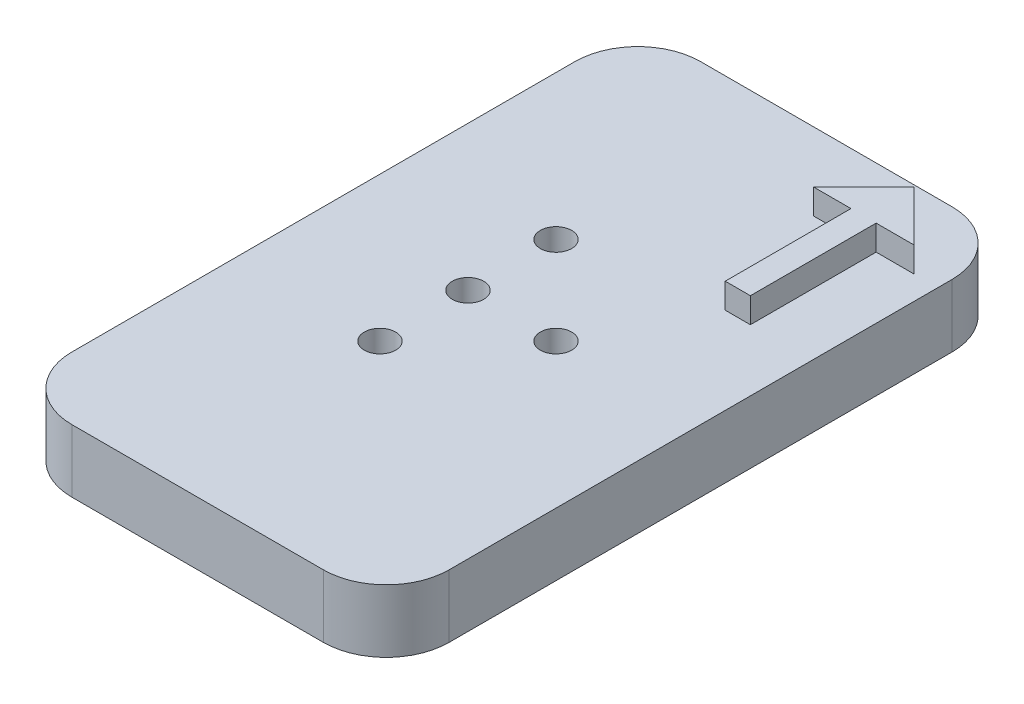
ISO-10303-21;
HEADER;
FILE_DESCRIPTION(('STEP AP214'),'2;1');
FILE_NAME('part.step','',(''),(''),'','','');
FILE_SCHEMA(('AUTOMOTIVE_DESIGN { 1 0 10303 214 1 1 1 1 }'));
ENDSEC;
DATA;
#1=APPLICATION_CONTEXT('core data for automotive mechanical design processes');
#2=APPLICATION_PROTOCOL_DEFINITION('international standard','automotive_design',2000,#1);
#3=PRODUCT_CONTEXT('',#1,'mechanical');
#4=PRODUCT('Part','Part','',(#3));
#5=PRODUCT_RELATED_PRODUCT_CATEGORY('part','',(#4));
#6=PRODUCT_DEFINITION_FORMATION('','',#4);
#7=PRODUCT_DEFINITION_CONTEXT('part definition',#1,'design');
#8=PRODUCT_DEFINITION('design','',#6,#7);
#9=PRODUCT_DEFINITION_SHAPE('','',#8);
#10=(LENGTH_UNIT() NAMED_UNIT(*) SI_UNIT(.MILLI.,.METRE.));
#11=(NAMED_UNIT(*) PLANE_ANGLE_UNIT() SI_UNIT($,.RADIAN.));
#12=(NAMED_UNIT(*) SI_UNIT($,.STERADIAN.) SOLID_ANGLE_UNIT());
#13=UNCERTAINTY_MEASURE_WITH_UNIT(LENGTH_MEASURE(1.E-05),#10,'distance_accuracy_value','');
#14=(GEOMETRIC_REPRESENTATION_CONTEXT(3) GLOBAL_UNCERTAINTY_ASSIGNED_CONTEXT((#13)) GLOBAL_UNIT_ASSIGNED_CONTEXT((#10,
#11,#12)) REPRESENTATION_CONTEXT('',''));
#15=CARTESIAN_POINT('',(0.,0.,0.));
#16=DIRECTION('',(0.,0.,1.));
#17=DIRECTION('',(1.,0.,0.));
#18=AXIS2_PLACEMENT_3D('',#15,#16,#17);
#19=CARTESIAN_POINT('',(0.,5.,0.));
#20=DIRECTION('',(0.,1.,0.));
#21=DIRECTION('',(0.,0.,1.));
#22=AXIS2_PLACEMENT_3D('',#19,#20,#21);
#23=PLANE('',#22);
#24=CARTESIAN_POINT('',(7.,5.,0.));
#25=DIRECTION('',(0.,1.,0.));
#26=DIRECTION('',(0.,0.,1.));
#27=AXIS2_PLACEMENT_3D('',#24,#25,#26);
#28=CIRCLE('',#27,1.25);
#29=CARTESIAN_POINT('',(7.,5.,1.25));
#30=VERTEX_POINT('',#29);
#31=EDGE_CURVE('E178',#30,#30,#28,.T.);
#32=ORIENTED_EDGE('',*,*,#31,.F.);
#33=EDGE_LOOP('',(#32));
#34=FACE_BOUND('',#33,.T.);
#35=CARTESIAN_POINT('',(0.,5.,0.));
#36=DIRECTION('',(0.,1.,0.));
#37=DIRECTION('',(0.,0.,1.));
#38=AXIS2_PLACEMENT_3D('',#35,#36,#37);
#39=CIRCLE('',#38,1.25);
#40=CARTESIAN_POINT('',(0.,5.,1.25));
#41=VERTEX_POINT('',#40);
#42=EDGE_CURVE('E190',#41,#41,#39,.T.);
#43=ORIENTED_EDGE('',*,*,#42,.F.);
#44=EDGE_LOOP('',(#43));
#45=FACE_BOUND('',#44,.T.);
#46=DIRECTION('',(0.,0.,1.));
#47=VECTOR('',#46,1.);
#48=CARTESIAN_POINT('',(-11.5,5.,-25.));
#49=LINE('',#48,#47);
#50=CARTESIAN_POINT('',(-11.5,5.,-20.));
#51=VERTEX_POINT('',#50);
#52=CARTESIAN_POINT('',(-11.5,5.,20.));
#53=VERTEX_POINT('',#52);
#54=EDGE_CURVE('E196',#51,#53,#49,.T.);
#55=ORIENTED_EDGE('',*,*,#54,.T.);
#56=CARTESIAN_POINT('',(-6.5,5.,20.));
#57=DIRECTION('',(0.,1.,0.));
#58=DIRECTION('',(0.,0.,1.));
#59=AXIS2_PLACEMENT_3D('',#56,#57,#58);
#60=CIRCLE('',#59,5.);
#61=CARTESIAN_POINT('',(-6.5,5.,25.));
#62=VERTEX_POINT('',#61);
#63=EDGE_CURVE('E241',#53,#62,#60,.T.);
#64=ORIENTED_EDGE('',*,*,#63,.T.);
#65=DIRECTION('',(1.,0.,0.));
#66=VECTOR('',#65,1.);
#67=CARTESIAN_POINT('',(-11.5,5.,25.));
#68=LINE('',#67,#66);
#69=CARTESIAN_POINT('',(13.5,5.,25.));
#70=VERTEX_POINT('',#69);
#71=EDGE_CURVE('E199',#62,#70,#68,.T.);
#72=ORIENTED_EDGE('',*,*,#71,.T.);
#73=CARTESIAN_POINT('',(13.5,5.,20.));
#74=DIRECTION('',(0.,1.,0.));
#75=DIRECTION('',(0.,0.,1.));
#76=AXIS2_PLACEMENT_3D('',#73,#74,#75);
#77=CIRCLE('',#76,5.);
#78=CARTESIAN_POINT('',(18.5,5.,20.));
#79=VERTEX_POINT('',#78);
#80=EDGE_CURVE('E239',#70,#79,#77,.T.);
#81=ORIENTED_EDGE('',*,*,#80,.T.);
#82=DIRECTION('',(0.,0.,-1.));
#83=VECTOR('',#82,1.);
#84=CARTESIAN_POINT('',(18.5,5.,-25.));
#85=LINE('',#84,#83);
#86=CARTESIAN_POINT('',(18.5,5.,-20.));
#87=VERTEX_POINT('',#86);
#88=EDGE_CURVE('E203',#79,#87,#85,.T.);
#89=ORIENTED_EDGE('',*,*,#88,.T.);
#90=CARTESIAN_POINT('',(13.5,5.,-20.));
#91=DIRECTION('',(0.,1.,0.));
#92=DIRECTION('',(0.,0.,1.));
#93=AXIS2_PLACEMENT_3D('',#90,#91,#92);
#94=CIRCLE('',#93,5.);
#95=CARTESIAN_POINT('',(13.5,5.,-25.));
#96=VERTEX_POINT('',#95);
#97=EDGE_CURVE('E237',#87,#96,#94,.T.);
#98=ORIENTED_EDGE('',*,*,#97,.T.);
#99=DIRECTION('',(-1.,0.,0.));
#100=VECTOR('',#99,1.);
#101=CARTESIAN_POINT('',(-11.5,5.,-25.));
#102=LINE('',#101,#100);
#103=CARTESIAN_POINT('',(-6.50000000000001,5.,-25.));
#104=VERTEX_POINT('',#103);
#105=EDGE_CURVE('E206',#96,#104,#102,.T.);
#106=ORIENTED_EDGE('',*,*,#105,.T.);
#107=CARTESIAN_POINT('',(-6.50000000000001,5.,-20.));
#108=DIRECTION('',(0.,1.,0.));
#109=DIRECTION('',(0.,0.,1.));
#110=AXIS2_PLACEMENT_3D('',#107,#108,#109);
#111=CIRCLE('',#110,5.);
#112=EDGE_CURVE('E235',#104,#51,#111,.T.);
#113=ORIENTED_EDGE('',*,*,#112,.T.);
#114=EDGE_LOOP('',(#55,#64,#72,#81,#89,#98,#106,#113));
#115=FACE_BOUND('',#114,.T.);
#116=CARTESIAN_POINT('',(0.,5.,-7.));
#117=DIRECTION('',(0.,1.,0.));
#118=DIRECTION('',(0.,0.,1.));
#119=AXIS2_PLACEMENT_3D('',#116,#117,#118);
#120=CIRCLE('',#119,1.25);
#121=CARTESIAN_POINT('',(0.,5.,-5.75));
#122=VERTEX_POINT('',#121);
#123=EDGE_CURVE('E184',#122,#122,#120,.T.);
#124=ORIENTED_EDGE('',*,*,#123,.F.);
#125=EDGE_LOOP('',(#124));
#126=FACE_BOUND('',#125,.T.);
#127=CARTESIAN_POINT('',(0.,5.,7.));
#128=DIRECTION('',(0.,1.,0.));
#129=DIRECTION('',(0.,0.,1.));
#130=AXIS2_PLACEMENT_3D('',#127,#128,#129);
#131=CIRCLE('',#130,1.25);
#132=CARTESIAN_POINT('',(0.,5.,8.25));
#133=VERTEX_POINT('',#132);
#134=EDGE_CURVE('E169',#133,#133,#131,.T.);
#135=ORIENTED_EDGE('',*,*,#134,.F.);
#136=EDGE_LOOP('',(#135));
#137=FACE_BOUND('',#136,.T.);
#138=DIRECTION('',(0.,0.,1.));
#139=VECTOR('',#138,1.);
#140=CARTESIAN_POINT('',(11.6008130371531,5.,-18.8562206984604));
#141=LINE('',#140,#139);
#142=CARTESIAN_POINT('',(11.6008130371531,5.,-18.8562206984604));
#143=VERTEX_POINT('',#142);
#144=CARTESIAN_POINT('',(11.6008130371531,5.,-8.85622069846038));
#145=VERTEX_POINT('',#144);
#146=EDGE_CURVE('E466',#143,#145,#141,.T.);
#147=ORIENTED_EDGE('',*,*,#146,.F.);
#148=DIRECTION('',(1.,0.,0.));
#149=VECTOR('',#148,1.);
#150=CARTESIAN_POINT('',(8.6008130371531,5.,-18.8562206984604));
#151=LINE('',#150,#149);
#152=CARTESIAN_POINT('',(8.6008130371531,5.,-18.8562206984604));
#153=VERTEX_POINT('',#152);
#154=EDGE_CURVE('E164',#153,#143,#151,.T.);
#155=ORIENTED_EDGE('',*,*,#154,.F.);
#156=DIRECTION('',(-0.707106781186547,0.,0.707106781186547));
#157=VECTOR('',#156,1.);
#158=CARTESIAN_POINT('',(12.6008130371531,5.,-22.8562206984604));
#159=LINE('',#158,#157);
#160=CARTESIAN_POINT('',(12.6008130371531,5.,-22.8562206984604));
#161=VERTEX_POINT('',#160);
#162=EDGE_CURVE('E160',#161,#153,#159,.T.);
#163=ORIENTED_EDGE('',*,*,#162,.F.);
#164=DIRECTION('',(-0.707106781186547,0.,-0.707106781186547));
#165=VECTOR('',#164,1.);
#166=CARTESIAN_POINT('',(16.6008130371531,5.,-18.8562206984604));
#167=LINE('',#166,#165);
#168=CARTESIAN_POINT('',(16.6008130371531,5.,-18.8562206984604));
#169=VERTEX_POINT('',#168);
#170=EDGE_CURVE('E462',#169,#161,#167,.T.);
#171=ORIENTED_EDGE('',*,*,#170,.F.);
#172=DIRECTION('',(1.,0.,0.));
#173=VECTOR('',#172,1.);
#174=CARTESIAN_POINT('',(13.6008130371531,5.,-18.8562206984604));
#175=LINE('',#174,#173);
#176=CARTESIAN_POINT('',(13.6008130371531,5.,-18.8562206984604));
#177=VERTEX_POINT('',#176);
#178=EDGE_CURVE('E476',#177,#169,#175,.T.);
#179=ORIENTED_EDGE('',*,*,#178,.F.);
#180=DIRECTION('',(0.,0.,-1.));
#181=VECTOR('',#180,1.);
#182=CARTESIAN_POINT('',(13.6008130371531,5.,-8.85622069846038));
#183=LINE('',#182,#181);
#184=CARTESIAN_POINT('',(13.6008130371531,5.,-8.85622069846038));
#185=VERTEX_POINT('',#184);
#186=EDGE_CURVE('E474',#185,#177,#183,.T.);
#187=ORIENTED_EDGE('',*,*,#186,.F.);
#188=DIRECTION('',(1.,0.,0.));
#189=VECTOR('',#188,1.);
#190=CARTESIAN_POINT('',(11.6008130371531,5.,-8.85622069846038));
#191=LINE('',#190,#189);
#192=EDGE_CURVE('E468',#145,#185,#191,.T.);
#193=ORIENTED_EDGE('',*,*,#192,.F.);
#194=EDGE_LOOP('',(#147,#155,#163,#171,#179,#187,#193));
#195=FACE_BOUND('',#194,.T.);
#196=ADVANCED_FACE('F33',(#34,#45,#115,#126,#137,#195),#23,.T.);
#197=CARTESIAN_POINT('',(0.,0.,0.));
#198=DIRECTION('',(0.,1.,0.));
#199=DIRECTION('',(0.,0.,1.));
#200=AXIS2_PLACEMENT_3D('',#197,#198,#199);
#201=PLANE('',#200);
#202=DIRECTION('',(1.,0.,0.));
#203=VECTOR('',#202,1.);
#204=CARTESIAN_POINT('',(-11.5,0.,25.));
#205=LINE('',#204,#203);
#206=CARTESIAN_POINT('',(-6.5,0.,25.));
#207=VERTEX_POINT('',#206);
#208=CARTESIAN_POINT('',(13.5,0.,25.));
#209=VERTEX_POINT('',#208);
#210=EDGE_CURVE('E211',#207,#209,#205,.T.);
#211=ORIENTED_EDGE('',*,*,#210,.F.);
#212=CARTESIAN_POINT('',(-6.5,0.,20.));
#213=DIRECTION('',(0.,1.,0.));
#214=DIRECTION('',(0.,0.,1.));
#215=AXIS2_PLACEMENT_3D('',#212,#213,#214);
#216=CIRCLE('',#215,5.);
#217=CARTESIAN_POINT('',(-11.5,0.,20.));
#218=VERTEX_POINT('',#217);
#219=EDGE_CURVE('E228',#207,#218,#216,.F.);
#220=ORIENTED_EDGE('',*,*,#219,.T.);
#221=DIRECTION('',(0.,0.,1.));
#222=VECTOR('',#221,1.);
#223=CARTESIAN_POINT('',(-11.5,0.,-25.));
#224=LINE('',#223,#222);
#225=CARTESIAN_POINT('',(-11.5,0.,-20.));
#226=VERTEX_POINT('',#225);
#227=EDGE_CURVE('E193',#226,#218,#224,.T.);
#228=ORIENTED_EDGE('',*,*,#227,.F.);
#229=CARTESIAN_POINT('',(-6.50000000000001,0.,-20.));
#230=DIRECTION('',(0.,1.,0.));
#231=DIRECTION('',(0.,0.,1.));
#232=AXIS2_PLACEMENT_3D('',#229,#230,#231);
#233=CIRCLE('',#232,5.);
#234=CARTESIAN_POINT('',(-6.50000000000001,0.,-25.));
#235=VERTEX_POINT('',#234);
#236=EDGE_CURVE('E222',#226,#235,#233,.F.);
#237=ORIENTED_EDGE('',*,*,#236,.T.);
#238=DIRECTION('',(-1.,0.,0.));
#239=VECTOR('',#238,1.);
#240=CARTESIAN_POINT('',(-11.5,0.,-25.));
#241=LINE('',#240,#239);
#242=CARTESIAN_POINT('',(13.5,0.,-25.));
#243=VERTEX_POINT('',#242);
#244=EDGE_CURVE('E200',#243,#235,#241,.T.);
#245=ORIENTED_EDGE('',*,*,#244,.F.);
#246=CARTESIAN_POINT('',(13.5,0.,-20.));
#247=DIRECTION('',(0.,1.,0.));
#248=DIRECTION('',(0.,0.,1.));
#249=AXIS2_PLACEMENT_3D('',#246,#247,#248);
#250=CIRCLE('',#249,5.);
#251=CARTESIAN_POINT('',(18.5,0.,-20.));
#252=VERTEX_POINT('',#251);
#253=EDGE_CURVE('E224',#243,#252,#250,.F.);
#254=ORIENTED_EDGE('',*,*,#253,.T.);
#255=DIRECTION('',(0.,0.,-1.));
#256=VECTOR('',#255,1.);
#257=CARTESIAN_POINT('',(18.5,0.,-25.));
#258=LINE('',#257,#256);
#259=CARTESIAN_POINT('',(18.5,0.,20.));
#260=VERTEX_POINT('',#259);
#261=EDGE_CURVE('E214',#260,#252,#258,.T.);
#262=ORIENTED_EDGE('',*,*,#261,.F.);
#263=CARTESIAN_POINT('',(13.5,0.,20.));
#264=DIRECTION('',(0.,1.,0.));
#265=DIRECTION('',(0.,0.,1.));
#266=AXIS2_PLACEMENT_3D('',#263,#264,#265);
#267=CIRCLE('',#266,5.);
#268=EDGE_CURVE('E226',#260,#209,#267,.F.);
#269=ORIENTED_EDGE('',*,*,#268,.T.);
#270=EDGE_LOOP('',(#211,#220,#228,#237,#245,#254,#262,#269));
#271=FACE_BOUND('',#270,.T.);
#272=CARTESIAN_POINT('',(0.,0.,0.));
#273=DIRECTION('',(0.,1.,0.));
#274=DIRECTION('',(0.,0.,1.));
#275=AXIS2_PLACEMENT_3D('',#272,#273,#274);
#276=CIRCLE('',#275,1.25);
#277=CARTESIAN_POINT('',(0.,0.,1.25));
#278=VERTEX_POINT('',#277);
#279=EDGE_CURVE('E187',#278,#278,#276,.T.);
#280=ORIENTED_EDGE('',*,*,#279,.T.);
#281=EDGE_LOOP('',(#280));
#282=FACE_BOUND('',#281,.T.);
#283=CARTESIAN_POINT('',(0.,0.,-7.));
#284=DIRECTION('',(0.,1.,0.));
#285=DIRECTION('',(0.,0.,1.));
#286=AXIS2_PLACEMENT_3D('',#283,#284,#285);
#287=CIRCLE('',#286,1.25);
#288=CARTESIAN_POINT('',(0.,0.,-5.75));
#289=VERTEX_POINT('',#288);
#290=EDGE_CURVE('E181',#289,#289,#287,.T.);
#291=ORIENTED_EDGE('',*,*,#290,.T.);
#292=EDGE_LOOP('',(#291));
#293=FACE_BOUND('',#292,.T.);
#294=CARTESIAN_POINT('',(7.,0.,0.));
#295=DIRECTION('',(0.,1.,0.));
#296=DIRECTION('',(0.,0.,1.));
#297=AXIS2_PLACEMENT_3D('',#294,#295,#296);
#298=CIRCLE('',#297,1.25);
#299=CARTESIAN_POINT('',(7.,0.,1.25));
#300=VERTEX_POINT('',#299);
#301=EDGE_CURVE('E176',#300,#300,#298,.T.);
#302=ORIENTED_EDGE('',*,*,#301,.T.);
#303=EDGE_LOOP('',(#302));
#304=FACE_BOUND('',#303,.T.);
#305=CARTESIAN_POINT('',(0.,0.,7.));
#306=DIRECTION('',(0.,1.,0.));
#307=DIRECTION('',(0.,0.,1.));
#308=AXIS2_PLACEMENT_3D('',#305,#306,#307);
#309=CIRCLE('',#308,1.25);
#310=CARTESIAN_POINT('',(0.,0.,8.25));
#311=VERTEX_POINT('',#310);
#312=EDGE_CURVE('E166',#311,#311,#309,.T.);
#313=ORIENTED_EDGE('',*,*,#312,.T.);
#314=EDGE_LOOP('',(#313));
#315=FACE_BOUND('',#314,.T.);
#316=ADVANCED_FACE('F257',(#271,#282,#293,#304,#315),#201,.F.);
#317=CARTESIAN_POINT('',(-11.5,5.,-25.));
#318=DIRECTION('',(1.,0.,0.));
#319=DIRECTION('',(0.,0.,-1.));
#320=AXIS2_PLACEMENT_3D('',#317,#318,#319);
#321=PLANE('',#320);
#322=ORIENTED_EDGE('',*,*,#227,.T.);
#323=DIRECTION('',(0.,-1.,0.));
#324=VECTOR('',#323,1.);
#325=CARTESIAN_POINT('',(-11.5,5.,20.));
#326=LINE('',#325,#324);
#327=EDGE_CURVE('E233',#218,#53,#326,.F.);
#328=ORIENTED_EDGE('',*,*,#327,.T.);
#329=ORIENTED_EDGE('',*,*,#54,.F.);
#330=DIRECTION('',(0.,-1.,0.));
#331=VECTOR('',#330,1.);
#332=CARTESIAN_POINT('',(-11.5,5.,-20.));
#333=LINE('',#332,#331);
#334=EDGE_CURVE('E230',#51,#226,#333,.T.);
#335=ORIENTED_EDGE('',*,*,#334,.T.);
#336=EDGE_LOOP('',(#322,#328,#329,#335));
#337=FACE_BOUND('',#336,.T.);
#338=ADVANCED_FACE('F273',(#337),#321,.F.);
#339=CARTESIAN_POINT('',(-11.5,5.,25.));
#340=DIRECTION('',(0.,0.,-1.));
#341=DIRECTION('',(-1.,0.,0.));
#342=AXIS2_PLACEMENT_3D('',#339,#340,#341);
#343=PLANE('',#342);
#344=ORIENTED_EDGE('',*,*,#71,.F.);
#345=DIRECTION('',(0.,-1.,0.));
#346=VECTOR('',#345,1.);
#347=CARTESIAN_POINT('',(-6.5,5.,25.));
#348=LINE('',#347,#346);
#349=EDGE_CURVE('E219',#62,#207,#348,.T.);
#350=ORIENTED_EDGE('',*,*,#349,.T.);
#351=ORIENTED_EDGE('',*,*,#210,.T.);
#352=DIRECTION('',(0.,-1.,0.));
#353=VECTOR('',#352,1.);
#354=CARTESIAN_POINT('',(13.5,5.,25.));
#355=LINE('',#354,#353);
#356=EDGE_CURVE('E208',#209,#70,#355,.F.);
#357=ORIENTED_EDGE('',*,*,#356,.T.);
#358=EDGE_LOOP('',(#344,#350,#351,#357));
#359=FACE_BOUND('',#358,.T.);
#360=ADVANCED_FACE('F281',(#359),#343,.F.);
#361=CARTESIAN_POINT('',(18.5,5.,-25.));
#362=DIRECTION('',(-1.,0.,0.));
#363=DIRECTION('',(0.,0.,1.));
#364=AXIS2_PLACEMENT_3D('',#361,#362,#363);
#365=PLANE('',#364);
#366=ORIENTED_EDGE('',*,*,#88,.F.);
#367=DIRECTION('',(0.,-1.,0.));
#368=VECTOR('',#367,1.);
#369=CARTESIAN_POINT('',(18.5,5.,20.));
#370=LINE('',#369,#368);
#371=EDGE_CURVE('E245',#79,#260,#370,.T.);
#372=ORIENTED_EDGE('',*,*,#371,.T.);
#373=ORIENTED_EDGE('',*,*,#261,.T.);
#374=DIRECTION('',(0.,-1.,0.));
#375=VECTOR('',#374,1.);
#376=CARTESIAN_POINT('',(18.5,5.,-20.));
#377=LINE('',#376,#375);
#378=EDGE_CURVE('E243',#252,#87,#377,.F.);
#379=ORIENTED_EDGE('',*,*,#378,.T.);
#380=EDGE_LOOP('',(#366,#372,#373,#379));
#381=FACE_BOUND('',#380,.T.);
#382=ADVANCED_FACE('F251',(#381),#365,.F.);
#383=CARTESIAN_POINT('',(-11.5,5.,-25.));
#384=DIRECTION('',(0.,0.,1.));
#385=DIRECTION('',(1.,0.,0.));
#386=AXIS2_PLACEMENT_3D('',#383,#384,#385);
#387=PLANE('',#386);
#388=ORIENTED_EDGE('',*,*,#105,.F.);
#389=DIRECTION('',(0.,-1.,0.));
#390=VECTOR('',#389,1.);
#391=CARTESIAN_POINT('',(13.5,5.,-25.));
#392=LINE('',#391,#390);
#393=EDGE_CURVE('E11',#96,#243,#392,.T.);
#394=ORIENTED_EDGE('',*,*,#393,.T.);
#395=ORIENTED_EDGE('',*,*,#244,.T.);
#396=DIRECTION('',(0.,-1.,0.));
#397=VECTOR('',#396,1.);
#398=CARTESIAN_POINT('',(-6.50000000000001,5.,-25.));
#399=LINE('',#398,#397);
#400=EDGE_CURVE('E41',#235,#104,#399,.F.);
#401=ORIENTED_EDGE('',*,*,#400,.T.);
#402=EDGE_LOOP('',(#388,#394,#395,#401));
#403=FACE_BOUND('',#402,.T.);
#404=ADVANCED_FACE('F264',(#403),#387,.F.);
#405=CARTESIAN_POINT('',(0.,5.,0.));
#406=DIRECTION('',(0.,-1.,0.));
#407=DIRECTION('',(0.,0.,-1.));
#408=AXIS2_PLACEMENT_3D('',#405,#406,#407);
#409=CYLINDRICAL_SURFACE('',#408,1.25);
#410=ORIENTED_EDGE('',*,*,#42,.T.);
#411=EDGE_LOOP('',(#410));
#412=FACE_BOUND('',#411,.T.);
#413=ORIENTED_EDGE('',*,*,#279,.F.);
#414=EDGE_LOOP('',(#413));
#415=FACE_BOUND('',#414,.T.);
#416=ADVANCED_FACE('F302',(#412,#415),#409,.F.);
#417=CARTESIAN_POINT('',(0.,5.,-7.));
#418=DIRECTION('',(0.,-1.,0.));
#419=DIRECTION('',(0.,0.,-1.));
#420=AXIS2_PLACEMENT_3D('',#417,#418,#419);
#421=CYLINDRICAL_SURFACE('',#420,1.25);
#422=ORIENTED_EDGE('',*,*,#123,.T.);
#423=EDGE_LOOP('',(#422));
#424=FACE_BOUND('',#423,.T.);
#425=ORIENTED_EDGE('',*,*,#290,.F.);
#426=EDGE_LOOP('',(#425));
#427=FACE_BOUND('',#426,.T.);
#428=ADVANCED_FACE('F335',(#424,#427),#421,.F.);
#429=CARTESIAN_POINT('',(7.,5.,0.));
#430=DIRECTION('',(0.,-1.,0.));
#431=DIRECTION('',(0.,0.,-1.));
#432=AXIS2_PLACEMENT_3D('',#429,#430,#431);
#433=CYLINDRICAL_SURFACE('',#432,1.25);
#434=ORIENTED_EDGE('',*,*,#31,.T.);
#435=EDGE_LOOP('',(#434));
#436=FACE_BOUND('',#435,.T.);
#437=ORIENTED_EDGE('',*,*,#301,.F.);
#438=EDGE_LOOP('',(#437));
#439=FACE_BOUND('',#438,.T.);
#440=ADVANCED_FACE('F342',(#436,#439),#433,.F.);
#441=CARTESIAN_POINT('',(0.,5.,7.));
#442=DIRECTION('',(0.,-1.,0.));
#443=DIRECTION('',(0.,0.,-1.));
#444=AXIS2_PLACEMENT_3D('',#441,#442,#443);
#445=CYLINDRICAL_SURFACE('',#444,1.25);
#446=ORIENTED_EDGE('',*,*,#134,.T.);
#447=EDGE_LOOP('',(#446));
#448=FACE_BOUND('',#447,.T.);
#449=ORIENTED_EDGE('',*,*,#312,.F.);
#450=EDGE_LOOP('',(#449));
#451=FACE_BOUND('',#450,.T.);
#452=ADVANCED_FACE('F290',(#448,#451),#445,.F.);
#453=CARTESIAN_POINT('',(-6.5,5.,20.));
#454=DIRECTION('',(0.,-1.,0.));
#455=DIRECTION('',(0.,0.,-1.));
#456=AXIS2_PLACEMENT_3D('',#453,#454,#455);
#457=CYLINDRICAL_SURFACE('',#456,5.);
#458=ORIENTED_EDGE('',*,*,#63,.F.);
#459=ORIENTED_EDGE('',*,*,#327,.F.);
#460=ORIENTED_EDGE('',*,*,#219,.F.);
#461=ORIENTED_EDGE('',*,*,#349,.F.);
#462=EDGE_LOOP('',(#458,#459,#460,#461));
#463=FACE_BOUND('',#462,.T.);
#464=ADVANCED_FACE('F278',(#463),#457,.T.);
#465=CARTESIAN_POINT('',(13.5,5.,20.));
#466=DIRECTION('',(0.,-1.,0.));
#467=DIRECTION('',(0.,0.,-1.));
#468=AXIS2_PLACEMENT_3D('',#465,#466,#467);
#469=CYLINDRICAL_SURFACE('',#468,5.);
#470=ORIENTED_EDGE('',*,*,#80,.F.);
#471=ORIENTED_EDGE('',*,*,#356,.F.);
#472=ORIENTED_EDGE('',*,*,#268,.F.);
#473=ORIENTED_EDGE('',*,*,#371,.F.);
#474=EDGE_LOOP('',(#470,#471,#472,#473));
#475=FACE_BOUND('',#474,.T.);
#476=ADVANCED_FACE('F283',(#475),#469,.T.);
#477=CARTESIAN_POINT('',(13.5,5.,-20.));
#478=DIRECTION('',(0.,-1.,0.));
#479=DIRECTION('',(0.,0.,-1.));
#480=AXIS2_PLACEMENT_3D('',#477,#478,#479);
#481=CYLINDRICAL_SURFACE('',#480,5.);
#482=ORIENTED_EDGE('',*,*,#97,.F.);
#483=ORIENTED_EDGE('',*,*,#378,.F.);
#484=ORIENTED_EDGE('',*,*,#253,.F.);
#485=ORIENTED_EDGE('',*,*,#393,.F.);
#486=EDGE_LOOP('',(#482,#483,#484,#485));
#487=FACE_BOUND('',#486,.T.);
#488=ADVANCED_FACE('F263',(#487),#481,.T.);
#489=CARTESIAN_POINT('',(-6.50000000000001,5.,-20.));
#490=DIRECTION('',(0.,-1.,0.));
#491=DIRECTION('',(0.,0.,-1.));
#492=AXIS2_PLACEMENT_3D('',#489,#490,#491);
#493=CYLINDRICAL_SURFACE('',#492,5.);
#494=ORIENTED_EDGE('',*,*,#112,.F.);
#495=ORIENTED_EDGE('',*,*,#400,.F.);
#496=ORIENTED_EDGE('',*,*,#236,.F.);
#497=ORIENTED_EDGE('',*,*,#334,.F.);
#498=EDGE_LOOP('',(#494,#495,#496,#497));
#499=FACE_BOUND('',#498,.T.);
#500=ADVANCED_FACE('F35',(#499),#493,.T.);
#501=CARTESIAN_POINT('',(8.6008130371531,7.,-18.8562206984604));
#502=DIRECTION('',(0.,0.,-1.));
#503=DIRECTION('',(-1.,0.,0.));
#504=AXIS2_PLACEMENT_3D('',#501,#502,#503);
#505=PLANE('',#504);
#506=ORIENTED_EDGE('',*,*,#154,.T.);
#507=DIRECTION('',(0.,-1.,0.));
#508=VECTOR('',#507,1.);
#509=CARTESIAN_POINT('',(11.6008130371531,7.,-18.8562206984604));
#510=LINE('',#509,#508);
#511=CARTESIAN_POINT('',(11.6008130371531,7.,-18.8562206984604));
#512=VERTEX_POINT('',#511);
#513=EDGE_CURVE('E145',#512,#143,#510,.T.);
#514=ORIENTED_EDGE('',*,*,#513,.F.);
#515=DIRECTION('',(1.,0.,0.));
#516=VECTOR('',#515,1.);
#517=CARTESIAN_POINT('',(8.6008130371531,7.,-18.8562206984604));
#518=LINE('',#517,#516);
#519=CARTESIAN_POINT('',(8.6008130371531,7.,-18.8562206984604));
#520=VERTEX_POINT('',#519);
#521=EDGE_CURVE('E152',#520,#512,#518,.T.);
#522=ORIENTED_EDGE('',*,*,#521,.F.);
#523=DIRECTION('',(0.,-1.,0.));
#524=VECTOR('',#523,1.);
#525=CARTESIAN_POINT('',(8.6008130371531,7.,-18.8562206984604));
#526=LINE('',#525,#524);
#527=EDGE_CURVE('E459',#520,#153,#526,.T.);
#528=ORIENTED_EDGE('',*,*,#527,.T.);
#529=EDGE_LOOP('',(#506,#514,#522,#528));
#530=FACE_BOUND('',#529,.T.);
#531=ADVANCED_FACE('F162',(#530),#505,.F.);
#532=CARTESIAN_POINT('',(11.6008130371531,7.,-18.8562206984604));
#533=DIRECTION('',(1.,0.,0.));
#534=DIRECTION('',(0.,0.,-1.));
#535=AXIS2_PLACEMENT_3D('',#532,#533,#534);
#536=PLANE('',#535);
#537=ORIENTED_EDGE('',*,*,#146,.T.);
#538=DIRECTION('',(0.,-1.,0.));
#539=VECTOR('',#538,1.);
#540=CARTESIAN_POINT('',(11.6008130371531,7.,-8.85622069846038));
#541=LINE('',#540,#539);
#542=CARTESIAN_POINT('',(11.6008130371531,7.,-8.85622069846038));
#543=VERTEX_POINT('',#542);
#544=EDGE_CURVE('E148',#543,#145,#541,.T.);
#545=ORIENTED_EDGE('',*,*,#544,.F.);
#546=DIRECTION('',(0.,0.,1.));
#547=VECTOR('',#546,1.);
#548=CARTESIAN_POINT('',(11.6008130371531,7.,-18.8562206984604));
#549=LINE('',#548,#547);
#550=EDGE_CURVE('E141',#512,#543,#549,.T.);
#551=ORIENTED_EDGE('',*,*,#550,.F.);
#552=ORIENTED_EDGE('',*,*,#513,.T.);
#553=EDGE_LOOP('',(#537,#545,#551,#552));
#554=FACE_BOUND('',#553,.T.);
#555=ADVANCED_FACE('F143',(#554),#536,.F.);
#556=CARTESIAN_POINT('',(11.6008130371531,7.,-8.85622069846038));
#557=DIRECTION('',(0.,0.,-1.));
#558=DIRECTION('',(-1.,0.,0.));
#559=AXIS2_PLACEMENT_3D('',#556,#557,#558);
#560=PLANE('',#559);
#561=ORIENTED_EDGE('',*,*,#192,.T.);
#562=DIRECTION('',(0.,-1.,0.));
#563=VECTOR('',#562,1.);
#564=CARTESIAN_POINT('',(13.6008130371531,7.,-8.85622069846038));
#565=LINE('',#564,#563);
#566=CARTESIAN_POINT('',(13.6008130371531,7.,-8.85622069846038));
#567=VERTEX_POINT('',#566);
#568=EDGE_CURVE('E171',#567,#185,#565,.T.);
#569=ORIENTED_EDGE('',*,*,#568,.F.);
#570=DIRECTION('',(1.,0.,0.));
#571=VECTOR('',#570,1.);
#572=CARTESIAN_POINT('',(11.6008130371531,7.,-8.85622069846038));
#573=LINE('',#572,#571);
#574=EDGE_CURVE('E151',#543,#567,#573,.T.);
#575=ORIENTED_EDGE('',*,*,#574,.F.);
#576=ORIENTED_EDGE('',*,*,#544,.T.);
#577=EDGE_LOOP('',(#561,#569,#575,#576));
#578=FACE_BOUND('',#577,.T.);
#579=ADVANCED_FACE('F398',(#578),#560,.F.);
#580=CARTESIAN_POINT('',(13.6008130371531,7.,-8.85622069846038));
#581=DIRECTION('',(-1.,0.,0.));
#582=DIRECTION('',(0.,0.,1.));
#583=AXIS2_PLACEMENT_3D('',#580,#581,#582);
#584=PLANE('',#583);
#585=ORIENTED_EDGE('',*,*,#186,.T.);
#586=DIRECTION('',(0.,-1.,0.));
#587=VECTOR('',#586,1.);
#588=CARTESIAN_POINT('',(13.6008130371531,7.,-18.8562206984604));
#589=LINE('',#588,#587);
#590=CARTESIAN_POINT('',(13.6008130371531,7.,-18.8562206984604));
#591=VERTEX_POINT('',#590);
#592=EDGE_CURVE('E483',#591,#177,#589,.T.);
#593=ORIENTED_EDGE('',*,*,#592,.F.);
#594=DIRECTION('',(0.,0.,-1.));
#595=VECTOR('',#594,1.);
#596=CARTESIAN_POINT('',(13.6008130371531,7.,-8.85622069846038));
#597=LINE('',#596,#595);
#598=EDGE_CURVE('E490',#567,#591,#597,.T.);
#599=ORIENTED_EDGE('',*,*,#598,.F.);
#600=ORIENTED_EDGE('',*,*,#568,.T.);
#601=EDGE_LOOP('',(#585,#593,#599,#600));
#602=FACE_BOUND('',#601,.T.);
#603=ADVANCED_FACE('F407',(#602),#584,.F.);
#604=CARTESIAN_POINT('',(13.6008130371531,7.,-18.8562206984604));
#605=DIRECTION('',(0.,0.,-1.));
#606=DIRECTION('',(-1.,0.,0.));
#607=AXIS2_PLACEMENT_3D('',#604,#605,#606);
#608=PLANE('',#607);
#609=ORIENTED_EDGE('',*,*,#178,.T.);
#610=DIRECTION('',(0.,-1.,0.));
#611=VECTOR('',#610,1.);
#612=CARTESIAN_POINT('',(16.6008130371531,7.,-18.8562206984604));
#613=LINE('',#612,#611);
#614=CARTESIAN_POINT('',(16.6008130371531,7.,-18.8562206984604));
#615=VERTEX_POINT('',#614);
#616=EDGE_CURVE('E480',#615,#169,#613,.T.);
#617=ORIENTED_EDGE('',*,*,#616,.F.);
#618=DIRECTION('',(1.,0.,0.));
#619=VECTOR('',#618,1.);
#620=CARTESIAN_POINT('',(13.6008130371531,7.,-18.8562206984604));
#621=LINE('',#620,#619);
#622=EDGE_CURVE('E496',#591,#615,#621,.T.);
#623=ORIENTED_EDGE('',*,*,#622,.F.);
#624=ORIENTED_EDGE('',*,*,#592,.T.);
#625=EDGE_LOOP('',(#609,#617,#623,#624));
#626=FACE_BOUND('',#625,.T.);
#627=ADVANCED_FACE('F417',(#626),#608,.F.);
#628=CARTESIAN_POINT('',(16.6008130371531,7.,-18.8562206984604));
#629=DIRECTION('',(-0.707106781186547,0.,0.707106781186547));
#630=DIRECTION('',(0.707106781186548,0.,0.707106781186548));
#631=AXIS2_PLACEMENT_3D('',#628,#629,#630);
#632=PLANE('',#631);
#633=ORIENTED_EDGE('',*,*,#170,.T.);
#634=DIRECTION('',(0.,-1.,0.));
#635=VECTOR('',#634,1.);
#636=CARTESIAN_POINT('',(12.6008130371531,7.,-22.8562206984604));
#637=LINE('',#636,#635);
#638=CARTESIAN_POINT('',(12.6008130371531,7.,-22.8562206984604));
#639=VERTEX_POINT('',#638);
#640=EDGE_CURVE('E48',#639,#161,#637,.T.);
#641=ORIENTED_EDGE('',*,*,#640,.F.);
#642=DIRECTION('',(-0.707106781186547,0.,-0.707106781186547));
#643=VECTOR('',#642,1.);
#644=CARTESIAN_POINT('',(16.6008130371531,7.,-18.8562206984604));
#645=LINE('',#644,#643);
#646=EDGE_CURVE('E495',#615,#639,#645,.T.);
#647=ORIENTED_EDGE('',*,*,#646,.F.);
#648=ORIENTED_EDGE('',*,*,#616,.T.);
#649=EDGE_LOOP('',(#633,#641,#647,#648));
#650=FACE_BOUND('',#649,.T.);
#651=ADVANCED_FACE('F427',(#650),#632,.F.);
#652=CARTESIAN_POINT('',(12.6008130371531,7.,-22.8562206984604));
#653=DIRECTION('',(0.707106781186547,0.,0.707106781186547));
#654=DIRECTION('',(0.707106781186548,0.,-0.707106781186548));
#655=AXIS2_PLACEMENT_3D('',#652,#653,#654);
#656=PLANE('',#655);
#657=ORIENTED_EDGE('',*,*,#162,.T.);
#658=ORIENTED_EDGE('',*,*,#527,.F.);
#659=DIRECTION('',(-0.707106781186547,0.,0.707106781186547));
#660=VECTOR('',#659,1.);
#661=CARTESIAN_POINT('',(12.6008130371531,7.,-22.8562206984604));
#662=LINE('',#661,#660);
#663=EDGE_CURVE('E156',#639,#520,#662,.T.);
#664=ORIENTED_EDGE('',*,*,#663,.F.);
#665=ORIENTED_EDGE('',*,*,#640,.T.);
#666=EDGE_LOOP('',(#657,#658,#664,#665));
#667=FACE_BOUND('',#666,.T.);
#668=ADVANCED_FACE('F437',(#667),#656,.F.);
#669=CARTESIAN_POINT('',(0.,7.,0.));
#670=DIRECTION('',(0.,-1.,0.));
#671=DIRECTION('',(0.,0.,-1.));
#672=AXIS2_PLACEMENT_3D('',#669,#670,#671);
#673=PLANE('',#672);
#674=ORIENTED_EDGE('',*,*,#521,.T.);
#675=ORIENTED_EDGE('',*,*,#550,.T.);
#676=ORIENTED_EDGE('',*,*,#574,.T.);
#677=ORIENTED_EDGE('',*,*,#598,.T.);
#678=ORIENTED_EDGE('',*,*,#622,.T.);
#679=ORIENTED_EDGE('',*,*,#646,.T.);
#680=ORIENTED_EDGE('',*,*,#663,.T.);
#681=EDGE_LOOP('',(#674,#675,#676,#677,#678,#679,#680));
#682=FACE_BOUND('',#681,.T.);
#683=ADVANCED_FACE('F155',(#682),#673,.F.);
#684=CLOSED_SHELL('',(#196,#316,#338,#360,#382,#404,#416,#428,#440,#452,#464,#476,#488,#500,
#531,#555,#579,#603,#627,#651,#668,#683));
#685=MANIFOLD_SOLID_BREP('B2',#684);
#686=ADVANCED_BREP_SHAPE_REPRESENTATION('',(#18,#685),#14);
#687=SHAPE_DEFINITION_REPRESENTATION(#9,#686);
ENDSEC;
END-ISO-10303-21;
